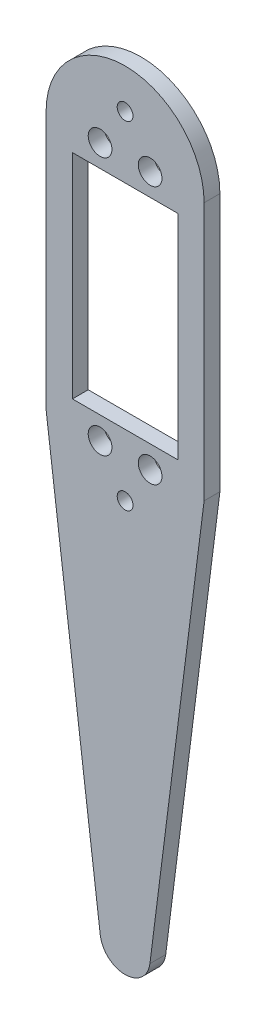
ISO-10303-21;
HEADER;
FILE_DESCRIPTION(('STEP AP214'),'2;1');
FILE_NAME('part.step','',(''),(''),'','','');
FILE_SCHEMA(('AUTOMOTIVE_DESIGN { 1 0 10303 214 1 1 1 1 }'));
ENDSEC;
DATA;
#1=APPLICATION_CONTEXT('core data for automotive mechanical design processes');
#2=APPLICATION_PROTOCOL_DEFINITION('international standard','automotive_design',2000,#1);
#3=PRODUCT_CONTEXT('',#1,'mechanical');
#4=PRODUCT('Part','Part','',(#3));
#5=PRODUCT_RELATED_PRODUCT_CATEGORY('part','',(#4));
#6=PRODUCT_DEFINITION_FORMATION('','',#4);
#7=PRODUCT_DEFINITION_CONTEXT('part definition',#1,'design');
#8=PRODUCT_DEFINITION('design','',#6,#7);
#9=PRODUCT_DEFINITION_SHAPE('','',#8);
#10=(LENGTH_UNIT() NAMED_UNIT(*) SI_UNIT(.MILLI.,.METRE.));
#11=(NAMED_UNIT(*) PLANE_ANGLE_UNIT() SI_UNIT($,.RADIAN.));
#12=(NAMED_UNIT(*) SI_UNIT($,.STERADIAN.) SOLID_ANGLE_UNIT());
#13=UNCERTAINTY_MEASURE_WITH_UNIT(LENGTH_MEASURE(1.E-05),#10,'distance_accuracy_value','');
#14=(GEOMETRIC_REPRESENTATION_CONTEXT(3) GLOBAL_UNCERTAINTY_ASSIGNED_CONTEXT((#13)) GLOBAL_UNIT_ASSIGNED_CONTEXT((#10,
#11,#12)) REPRESENTATION_CONTEXT('',''));
#15=CARTESIAN_POINT('',(0.,0.,0.));
#16=DIRECTION('',(0.,0.,1.));
#17=DIRECTION('',(1.,0.,0.));
#18=AXIS2_PLACEMENT_3D('',#15,#16,#17);
#19=CARTESIAN_POINT('',(9.99999999999545,44.7499999999967,3.));
#20=DIRECTION('',(0.,0.,1.));
#21=DIRECTION('',(1.,0.,0.));
#22=AXIS2_PLACEMENT_3D('',#19,#20,#21);
#23=PLANE('',#22);
#24=CARTESIAN_POINT('',(10.0000000000035,52.2499999999999,3.));
#25=DIRECTION('',(0.,0.,1.));
#26=DIRECTION('',(1.,0.,0.));
#27=AXIS2_PLACEMENT_3D('',#24,#25,#26);
#28=CIRCLE('',#27,1.5);
#29=CARTESIAN_POINT('',(11.5000000000035,52.2499999999999,3.));
#30=VERTEX_POINT('',#29);
#31=EDGE_CURVE('E285',#30,#30,#28,.T.);
#32=ORIENTED_EDGE('',*,*,#31,.F.);
#33=EDGE_LOOP('',(#32));
#34=FACE_BOUND('',#33,.T.);
#35=CARTESIAN_POINT('',(14.7499999999117,44.7499999999967,3.));
#36=DIRECTION('',(0.,0.,1.));
#37=DIRECTION('',(1.,0.,0.));
#38=AXIS2_PLACEMENT_3D('',#35,#36,#37);
#39=CIRCLE('',#38,2.25);
#40=CARTESIAN_POINT('',(16.9999999999117,44.7499999999967,3.));
#41=VERTEX_POINT('',#40);
#42=EDGE_CURVE('E297',#41,#41,#39,.T.);
#43=ORIENTED_EDGE('',*,*,#42,.F.);
#44=EDGE_LOOP('',(#43));
#45=FACE_BOUND('',#44,.T.);
#46=CARTESIAN_POINT('',(14.7499999999117,-4.25000000000659,3.));
#47=DIRECTION('',(0.,0.,1.));
#48=DIRECTION('',(1.,0.,0.));
#49=AXIS2_PLACEMENT_3D('',#46,#47,#48);
#50=CIRCLE('',#49,2.25);
#51=CARTESIAN_POINT('',(16.9999999999117,-4.25000000000659,3.));
#52=VERTEX_POINT('',#51);
#53=EDGE_CURVE('E142',#52,#52,#50,.T.);
#54=ORIENTED_EDGE('',*,*,#53,.F.);
#55=EDGE_LOOP('',(#54));
#56=FACE_BOUND('',#55,.T.);
#57=CARTESIAN_POINT('',(9.99999999999545,44.7499999999967,3.));
#58=DIRECTION('',(0.,0.,1.));
#59=DIRECTION('',(1.,0.,0.));
#60=AXIS2_PLACEMENT_3D('',#57,#58,#59);
#61=CIRCLE('',#60,14.9999999999159);
#62=CARTESIAN_POINT('',(24.999999999834,44.7499999999967,3.));
#63=VERTEX_POINT('',#62);
#64=CARTESIAN_POINT('',(-4.99999999999773,44.7499999999967,3.));
#65=VERTEX_POINT('',#64);
#66=EDGE_CURVE('E152',#63,#65,#61,.T.);
#67=ORIENTED_EDGE('',*,*,#66,.T.);
#68=DIRECTION('',(0.,-1.,0.));
#69=VECTOR('',#68,1.);
#70=CARTESIAN_POINT('',(-4.99999999999773,44.7499999999967,3.));
#71=LINE('',#70,#69);
#72=CARTESIAN_POINT('',(-4.99999999999773,-4.25000000000659,3.));
#73=VERTEX_POINT('',#72);
#74=EDGE_CURVE('E155',#65,#73,#71,.T.);
#75=ORIENTED_EDGE('',*,*,#74,.T.);
#76=DIRECTION('',(0.12563429234926,-0.992076622336148,0.));
#77=VECTOR('',#76,1.);
#78=CARTESIAN_POINT('',(-4.99999999999773,-4.25000000000659,3.));
#79=LINE('',#78,#77);
#80=CARTESIAN_POINT('',(5.28763604390686,-85.4867628886591,3.));
#81=VERTEX_POINT('',#80);
#82=EDGE_CURVE('E158',#73,#81,#79,.T.);
#83=ORIENTED_EDGE('',*,*,#82,.T.);
#84=CARTESIAN_POINT('',(10.0000000000036,-84.89,3.));
#85=DIRECTION('',(0.,0.,1.));
#86=DIRECTION('',(1.,0.,0.));
#87=AXIS2_PLACEMENT_3D('',#84,#85,#86);
#88=CIRCLE('',#87,4.75000000000001);
#89=CARTESIAN_POINT('',(14.7123639561003,-85.4867628886591,3.));
#90=VERTEX_POINT('',#89);
#91=EDGE_CURVE('E160',#81,#90,#88,.T.);
#92=ORIENTED_EDGE('',*,*,#91,.T.);
#93=DIRECTION('',(0.125634292347197,0.992076622336409,0.));
#94=VECTOR('',#93,1.);
#95=CARTESIAN_POINT('',(24.9999999998328,-4.25000000000989,3.));
#96=LINE('',#95,#94);
#97=CARTESIAN_POINT('',(24.9999999998328,-4.25000000000989,3.));
#98=VERTEX_POINT('',#97);
#99=EDGE_CURVE('E162',#90,#98,#96,.T.);
#100=ORIENTED_EDGE('',*,*,#99,.T.);
#101=DIRECTION('',(0.,1.,0.));
#102=VECTOR('',#101,1.);
#103=CARTESIAN_POINT('',(24.999999999834,44.7499999999967,3.));
#104=LINE('',#103,#102);
#105=EDGE_CURVE('E164',#98,#63,#104,.T.);
#106=ORIENTED_EDGE('',*,*,#105,.T.);
#107=EDGE_LOOP('',(#67,#75,#83,#92,#100,#106));
#108=FACE_BOUND('',#107,.T.);
#109=DIRECTION('',(1.,0.,0.));
#110=VECTOR('',#109,1.);
#111=CARTESIAN_POINT('',(0.,0.,3.));
#112=LINE('',#111,#110);
#113=CARTESIAN_POINT('',(0.,0.,3.));
#114=VERTEX_POINT('',#113);
#115=CARTESIAN_POINT('',(20.,0.,3.));
#116=VERTEX_POINT('',#115);
#117=EDGE_CURVE('E121',#114,#116,#112,.T.);
#118=ORIENTED_EDGE('',*,*,#117,.F.);
#119=DIRECTION('',(0.,-1.,0.));
#120=VECTOR('',#119,1.);
#121=CARTESIAN_POINT('',(0.,0.,3.));
#122=LINE('',#121,#120);
#123=CARTESIAN_POINT('',(0.,40.5,3.));
#124=VERTEX_POINT('',#123);
#125=EDGE_CURVE('E113',#124,#114,#122,.T.);
#126=ORIENTED_EDGE('',*,*,#125,.F.);
#127=DIRECTION('',(-1.,0.,0.));
#128=VECTOR('',#127,1.);
#129=CARTESIAN_POINT('',(0.,40.5,3.));
#130=LINE('',#129,#128);
#131=CARTESIAN_POINT('',(20.,40.5,3.));
#132=VERTEX_POINT('',#131);
#133=EDGE_CURVE('E136',#132,#124,#130,.T.);
#134=ORIENTED_EDGE('',*,*,#133,.F.);
#135=DIRECTION('',(0.,1.,0.));
#136=VECTOR('',#135,1.);
#137=CARTESIAN_POINT('',(20.,0.,3.));
#138=LINE('',#137,#136);
#139=EDGE_CURVE('E134',#116,#132,#138,.T.);
#140=ORIENTED_EDGE('',*,*,#139,.F.);
#141=EDGE_LOOP('',(#118,#126,#134,#140));
#142=FACE_BOUND('',#141,.T.);
#143=CARTESIAN_POINT('',(5.24999999991035,-4.25000000000659,3.));
#144=DIRECTION('',(0.,0.,1.));
#145=DIRECTION('',(1.,0.,0.));
#146=AXIS2_PLACEMENT_3D('',#143,#144,#145);
#147=CIRCLE('',#146,2.25);
#148=CARTESIAN_POINT('',(7.49999999991035,-4.25000000000659,3.));
#149=VERTEX_POINT('',#148);
#150=EDGE_CURVE('E303',#149,#149,#147,.T.);
#151=ORIENTED_EDGE('',*,*,#150,.F.);
#152=EDGE_LOOP('',(#151));
#153=FACE_BOUND('',#152,.T.);
#154=CARTESIAN_POINT('',(5.24999999991035,44.7499999999967,3.));
#155=DIRECTION('',(0.,0.,1.));
#156=DIRECTION('',(1.,0.,0.));
#157=AXIS2_PLACEMENT_3D('',#154,#155,#156);
#158=CIRCLE('',#157,2.25);
#159=CARTESIAN_POINT('',(7.49999999991035,44.7499999999967,3.));
#160=VERTEX_POINT('',#159);
#161=EDGE_CURVE('E291',#160,#160,#158,.T.);
#162=ORIENTED_EDGE('',*,*,#161,.F.);
#163=EDGE_LOOP('',(#162));
#164=FACE_BOUND('',#163,.T.);
#165=CARTESIAN_POINT('',(10.0000000000035,-11.75,3.));
#166=DIRECTION('',(0.,0.,1.));
#167=DIRECTION('',(1.,0.,0.));
#168=AXIS2_PLACEMENT_3D('',#165,#166,#167);
#169=CIRCLE('',#168,1.5);
#170=CARTESIAN_POINT('',(11.5000000000035,-11.75,3.));
#171=VERTEX_POINT('',#170);
#172=EDGE_CURVE('E276',#171,#171,#169,.T.);
#173=ORIENTED_EDGE('',*,*,#172,.F.);
#174=EDGE_LOOP('',(#173));
#175=FACE_BOUND('',#174,.T.);
#176=ADVANCED_FACE('F36',(#34,#45,#56,#108,#142,#153,#164,#175),#23,.T.);
#177=CARTESIAN_POINT('',(9.99999999999545,44.7499999999967,0.));
#178=DIRECTION('',(0.,0.,1.));
#179=DIRECTION('',(1.,0.,0.));
#180=AXIS2_PLACEMENT_3D('',#177,#178,#179);
#181=PLANE('',#180);
#182=CARTESIAN_POINT('',(10.0000000000035,52.2499999999999,0.));
#183=DIRECTION('',(0.,0.,1.));
#184=DIRECTION('',(1.,0.,0.));
#185=AXIS2_PLACEMENT_3D('',#182,#183,#184);
#186=CIRCLE('',#185,1.5);
#187=CARTESIAN_POINT('',(11.5000000000035,52.2499999999999,0.));
#188=VERTEX_POINT('',#187);
#189=EDGE_CURVE('E282',#188,#188,#186,.T.);
#190=ORIENTED_EDGE('',*,*,#189,.T.);
#191=EDGE_LOOP('',(#190));
#192=FACE_BOUND('',#191,.T.);
#193=CARTESIAN_POINT('',(14.7499999999117,44.7499999999967,0.));
#194=DIRECTION('',(0.,0.,1.));
#195=DIRECTION('',(1.,0.,0.));
#196=AXIS2_PLACEMENT_3D('',#193,#194,#195);
#197=CIRCLE('',#196,2.25);
#198=CARTESIAN_POINT('',(16.9999999999117,44.7499999999967,0.));
#199=VERTEX_POINT('',#198);
#200=EDGE_CURVE('E294',#199,#199,#197,.T.);
#201=ORIENTED_EDGE('',*,*,#200,.T.);
#202=EDGE_LOOP('',(#201));
#203=FACE_BOUND('',#202,.T.);
#204=CARTESIAN_POINT('',(14.7499999999117,-4.25000000000659,0.));
#205=DIRECTION('',(0.,0.,1.));
#206=DIRECTION('',(1.,0.,0.));
#207=AXIS2_PLACEMENT_3D('',#204,#205,#206);
#208=CIRCLE('',#207,2.25);
#209=CARTESIAN_POINT('',(16.9999999999117,-4.25000000000659,0.));
#210=VERTEX_POINT('',#209);
#211=EDGE_CURVE('E306',#210,#210,#208,.T.);
#212=ORIENTED_EDGE('',*,*,#211,.T.);
#213=EDGE_LOOP('',(#212));
#214=FACE_BOUND('',#213,.T.);
#215=CARTESIAN_POINT('',(9.99999999999545,44.7499999999967,0.));
#216=DIRECTION('',(0.,0.,1.));
#217=DIRECTION('',(1.,0.,0.));
#218=AXIS2_PLACEMENT_3D('',#215,#216,#217);
#219=CIRCLE('',#218,14.9999999999159);
#220=CARTESIAN_POINT('',(24.999999999834,44.7499999999967,0.));
#221=VERTEX_POINT('',#220);
#222=CARTESIAN_POINT('',(-4.99999999999773,44.7499999999967,0.));
#223=VERTEX_POINT('',#222);
#224=EDGE_CURVE('E129',#221,#223,#219,.T.);
#225=ORIENTED_EDGE('',*,*,#224,.F.);
#226=DIRECTION('',(0.,1.,0.));
#227=VECTOR('',#226,1.);
#228=CARTESIAN_POINT('',(24.999999999834,44.7499999999967,0.));
#229=LINE('',#228,#227);
#230=CARTESIAN_POINT('',(24.9999999998328,-4.25000000000989,0.));
#231=VERTEX_POINT('',#230);
#232=EDGE_CURVE('E156',#231,#221,#229,.T.);
#233=ORIENTED_EDGE('',*,*,#232,.F.);
#234=DIRECTION('',(0.125634292347197,0.992076622336409,0.));
#235=VECTOR('',#234,1.);
#236=CARTESIAN_POINT('',(24.9999999998328,-4.25000000000989,0.));
#237=LINE('',#236,#235);
#238=CARTESIAN_POINT('',(14.7123639561003,-85.4867628886591,0.));
#239=VERTEX_POINT('',#238);
#240=EDGE_CURVE('E175',#239,#231,#237,.T.);
#241=ORIENTED_EDGE('',*,*,#240,.F.);
#242=CARTESIAN_POINT('',(10.0000000000036,-84.89,0.));
#243=DIRECTION('',(0.,0.,1.));
#244=DIRECTION('',(1.,0.,0.));
#245=AXIS2_PLACEMENT_3D('',#242,#243,#244);
#246=CIRCLE('',#245,4.75000000000001);
#247=CARTESIAN_POINT('',(5.28763604390686,-85.4867628886591,0.));
#248=VERTEX_POINT('',#247);
#249=EDGE_CURVE('E173',#248,#239,#246,.T.);
#250=ORIENTED_EDGE('',*,*,#249,.F.);
#251=DIRECTION('',(0.12563429234926,-0.992076622336148,0.));
#252=VECTOR('',#251,1.);
#253=CARTESIAN_POINT('',(-4.99999999999773,-4.25000000000659,0.));
#254=LINE('',#253,#252);
#255=CARTESIAN_POINT('',(-4.99999999999773,-4.25000000000659,0.));
#256=VERTEX_POINT('',#255);
#257=EDGE_CURVE('E171',#256,#248,#254,.T.);
#258=ORIENTED_EDGE('',*,*,#257,.F.);
#259=DIRECTION('',(0.,-1.,0.));
#260=VECTOR('',#259,1.);
#261=CARTESIAN_POINT('',(-4.99999999999773,44.7499999999967,0.));
#262=LINE('',#261,#260);
#263=EDGE_CURVE('E169',#223,#256,#262,.T.);
#264=ORIENTED_EDGE('',*,*,#263,.F.);
#265=EDGE_LOOP('',(#225,#233,#241,#250,#258,#264));
#266=FACE_BOUND('',#265,.T.);
#267=DIRECTION('',(0.,-1.,0.));
#268=VECTOR('',#267,1.);
#269=CARTESIAN_POINT('',(0.,0.,0.));
#270=LINE('',#269,#268);
#271=CARTESIAN_POINT('',(0.,40.5,0.));
#272=VERTEX_POINT('',#271);
#273=CARTESIAN_POINT('',(0.,0.,0.));
#274=VERTEX_POINT('',#273);
#275=EDGE_CURVE('E59',#272,#274,#270,.T.);
#276=ORIENTED_EDGE('',*,*,#275,.T.);
#277=DIRECTION('',(1.,0.,0.));
#278=VECTOR('',#277,1.);
#279=CARTESIAN_POINT('',(0.,0.,0.));
#280=LINE('',#279,#278);
#281=CARTESIAN_POINT('',(20.,0.,0.));
#282=VERTEX_POINT('',#281);
#283=EDGE_CURVE('E128',#274,#282,#280,.T.);
#284=ORIENTED_EDGE('',*,*,#283,.T.);
#285=DIRECTION('',(0.,1.,0.));
#286=VECTOR('',#285,1.);
#287=CARTESIAN_POINT('',(20.,0.,0.));
#288=LINE('',#287,#286);
#289=CARTESIAN_POINT('',(20.,40.5,0.));
#290=VERTEX_POINT('',#289);
#291=EDGE_CURVE('E144',#282,#290,#288,.T.);
#292=ORIENTED_EDGE('',*,*,#291,.T.);
#293=DIRECTION('',(-1.,0.,0.));
#294=VECTOR('',#293,1.);
#295=CARTESIAN_POINT('',(0.,40.5,0.));
#296=LINE('',#295,#294);
#297=EDGE_CURVE('E122',#290,#272,#296,.T.);
#298=ORIENTED_EDGE('',*,*,#297,.T.);
#299=EDGE_LOOP('',(#276,#284,#292,#298));
#300=FACE_BOUND('',#299,.T.);
#301=CARTESIAN_POINT('',(5.24999999991035,-4.25000000000659,0.));
#302=DIRECTION('',(0.,0.,1.));
#303=DIRECTION('',(1.,0.,0.));
#304=AXIS2_PLACEMENT_3D('',#301,#302,#303);
#305=CIRCLE('',#304,2.25);
#306=CARTESIAN_POINT('',(7.49999999991035,-4.25000000000659,0.));
#307=VERTEX_POINT('',#306);
#308=EDGE_CURVE('E300',#307,#307,#305,.T.);
#309=ORIENTED_EDGE('',*,*,#308,.T.);
#310=EDGE_LOOP('',(#309));
#311=FACE_BOUND('',#310,.T.);
#312=CARTESIAN_POINT('',(5.24999999991035,44.7499999999967,0.));
#313=DIRECTION('',(0.,0.,1.));
#314=DIRECTION('',(1.,0.,0.));
#315=AXIS2_PLACEMENT_3D('',#312,#313,#314);
#316=CIRCLE('',#315,2.25);
#317=CARTESIAN_POINT('',(7.49999999991035,44.7499999999967,0.));
#318=VERTEX_POINT('',#317);
#319=EDGE_CURVE('E288',#318,#318,#316,.T.);
#320=ORIENTED_EDGE('',*,*,#319,.T.);
#321=EDGE_LOOP('',(#320));
#322=FACE_BOUND('',#321,.T.);
#323=CARTESIAN_POINT('',(10.0000000000035,-11.75,0.));
#324=DIRECTION('',(0.,0.,1.));
#325=DIRECTION('',(1.,0.,0.));
#326=AXIS2_PLACEMENT_3D('',#323,#324,#325);
#327=CIRCLE('',#326,1.5);
#328=CARTESIAN_POINT('',(11.5000000000035,-11.75,0.));
#329=VERTEX_POINT('',#328);
#330=EDGE_CURVE('E279',#329,#329,#327,.T.);
#331=ORIENTED_EDGE('',*,*,#330,.T.);
#332=EDGE_LOOP('',(#331));
#333=FACE_BOUND('',#332,.T.);
#334=ADVANCED_FACE('F199',(#192,#203,#214,#266,#300,#311,#322,#333),#181,.F.);
#335=CARTESIAN_POINT('',(9.99999999999545,44.7499999999967,3.));
#336=DIRECTION('',(0.,0.,-1.));
#337=DIRECTION('',(-1.,0.,0.));
#338=AXIS2_PLACEMENT_3D('',#335,#336,#337);
#339=CYLINDRICAL_SURFACE('',#338,14.9999999999159);
#340=ORIENTED_EDGE('',*,*,#224,.T.);
#341=DIRECTION('',(0.,0.,-1.));
#342=VECTOR('',#341,1.);
#343=CARTESIAN_POINT('',(-4.99999999999773,44.7499999999967,3.));
#344=LINE('',#343,#342);
#345=EDGE_CURVE('E11',#65,#223,#344,.T.);
#346=ORIENTED_EDGE('',*,*,#345,.F.);
#347=ORIENTED_EDGE('',*,*,#66,.F.);
#348=DIRECTION('',(0.,0.,-1.));
#349=VECTOR('',#348,1.);
#350=CARTESIAN_POINT('',(24.999999999834,44.7499999999967,3.));
#351=LINE('',#350,#349);
#352=EDGE_CURVE('E166',#63,#221,#351,.T.);
#353=ORIENTED_EDGE('',*,*,#352,.T.);
#354=EDGE_LOOP('',(#340,#346,#347,#353));
#355=FACE_BOUND('',#354,.T.);
#356=ADVANCED_FACE('F38',(#355),#339,.T.);
#357=CARTESIAN_POINT('',(-4.99999999999773,44.7499999999967,3.));
#358=DIRECTION('',(1.,0.,0.));
#359=DIRECTION('',(0.,0.,-1.));
#360=AXIS2_PLACEMENT_3D('',#357,#358,#359);
#361=PLANE('',#360);
#362=ORIENTED_EDGE('',*,*,#263,.T.);
#363=DIRECTION('',(0.,0.,-1.));
#364=VECTOR('',#363,1.);
#365=CARTESIAN_POINT('',(-4.99999999999773,-4.25000000000659,3.));
#366=LINE('',#365,#364);
#367=EDGE_CURVE('E44',#73,#256,#366,.T.);
#368=ORIENTED_EDGE('',*,*,#367,.F.);
#369=ORIENTED_EDGE('',*,*,#74,.F.);
#370=ORIENTED_EDGE('',*,*,#345,.T.);
#371=EDGE_LOOP('',(#362,#368,#369,#370));
#372=FACE_BOUND('',#371,.T.);
#373=ADVANCED_FACE('F216',(#372),#361,.F.);
#374=CARTESIAN_POINT('',(-4.99999999999773,-4.25000000000659,3.));
#375=DIRECTION('',(0.992076622336148,0.12563429234926,0.));
#376=DIRECTION('',(-0.12563429234926,0.992076622336148,0.));
#377=AXIS2_PLACEMENT_3D('',#374,#375,#376);
#378=PLANE('',#377);
#379=ORIENTED_EDGE('',*,*,#257,.T.);
#380=DIRECTION('',(0.,0.,-1.));
#381=VECTOR('',#380,1.);
#382=CARTESIAN_POINT('',(5.28763604390686,-85.4867628886591,3.));
#383=LINE('',#382,#381);
#384=EDGE_CURVE('E186',#81,#248,#383,.T.);
#385=ORIENTED_EDGE('',*,*,#384,.F.);
#386=ORIENTED_EDGE('',*,*,#82,.F.);
#387=ORIENTED_EDGE('',*,*,#367,.T.);
#388=EDGE_LOOP('',(#379,#385,#386,#387));
#389=FACE_BOUND('',#388,.T.);
#390=ADVANCED_FACE('F193',(#389),#378,.F.);
#391=CARTESIAN_POINT('',(10.0000000000036,-84.89,3.));
#392=DIRECTION('',(0.,0.,-1.));
#393=DIRECTION('',(-1.,0.,0.));
#394=AXIS2_PLACEMENT_3D('',#391,#392,#393);
#395=CYLINDRICAL_SURFACE('',#394,4.75000000000001);
#396=ORIENTED_EDGE('',*,*,#249,.T.);
#397=DIRECTION('',(0.,0.,-1.));
#398=VECTOR('',#397,1.);
#399=CARTESIAN_POINT('',(14.7123639561003,-85.4867628886591,3.));
#400=LINE('',#399,#398);
#401=EDGE_CURVE('E183',#90,#239,#400,.T.);
#402=ORIENTED_EDGE('',*,*,#401,.F.);
#403=ORIENTED_EDGE('',*,*,#91,.F.);
#404=ORIENTED_EDGE('',*,*,#384,.T.);
#405=EDGE_LOOP('',(#396,#402,#403,#404));
#406=FACE_BOUND('',#405,.T.);
#407=ADVANCED_FACE('F205',(#406),#395,.T.);
#408=CARTESIAN_POINT('',(24.9999999998328,-4.25000000000989,3.));
#409=DIRECTION('',(-0.992076622336409,0.125634292347197,0.));
#410=DIRECTION('',(-0.125634292347197,-0.99207662233641,0.));
#411=AXIS2_PLACEMENT_3D('',#408,#409,#410);
#412=PLANE('',#411);
#413=ORIENTED_EDGE('',*,*,#240,.T.);
#414=DIRECTION('',(0.,0.,-1.));
#415=VECTOR('',#414,1.);
#416=CARTESIAN_POINT('',(24.9999999998328,-4.25000000000989,3.));
#417=LINE('',#416,#415);
#418=EDGE_CURVE('E180',#98,#231,#417,.T.);
#419=ORIENTED_EDGE('',*,*,#418,.F.);
#420=ORIENTED_EDGE('',*,*,#99,.F.);
#421=ORIENTED_EDGE('',*,*,#401,.T.);
#422=EDGE_LOOP('',(#413,#419,#420,#421));
#423=FACE_BOUND('',#422,.T.);
#424=ADVANCED_FACE('F209',(#423),#412,.F.);
#425=CARTESIAN_POINT('',(24.999999999834,44.7499999999967,3.));
#426=DIRECTION('',(-1.,0.,0.));
#427=DIRECTION('',(0.,-1.,0.));
#428=AXIS2_PLACEMENT_3D('',#425,#426,#427);
#429=PLANE('',#428);
#430=ORIENTED_EDGE('',*,*,#232,.T.);
#431=ORIENTED_EDGE('',*,*,#352,.F.);
#432=ORIENTED_EDGE('',*,*,#105,.F.);
#433=ORIENTED_EDGE('',*,*,#418,.T.);
#434=EDGE_LOOP('',(#430,#431,#432,#433));
#435=FACE_BOUND('',#434,.T.);
#436=ADVANCED_FACE('F219',(#435),#429,.F.);
#437=CARTESIAN_POINT('',(0.,0.,3.));
#438=DIRECTION('',(1.,0.,0.));
#439=DIRECTION('',(0.,0.,-1.));
#440=AXIS2_PLACEMENT_3D('',#437,#438,#439);
#441=PLANE('',#440);
#442=ORIENTED_EDGE('',*,*,#275,.F.);
#443=DIRECTION('',(0.,0.,-1.));
#444=VECTOR('',#443,1.);
#445=CARTESIAN_POINT('',(0.,40.5,3.));
#446=LINE('',#445,#444);
#447=EDGE_CURVE('E117',#124,#272,#446,.T.);
#448=ORIENTED_EDGE('',*,*,#447,.F.);
#449=ORIENTED_EDGE('',*,*,#125,.T.);
#450=DIRECTION('',(0.,0.,-1.));
#451=VECTOR('',#450,1.);
#452=CARTESIAN_POINT('',(0.,0.,3.));
#453=LINE('',#452,#451);
#454=EDGE_CURVE('E116',#114,#274,#453,.T.);
#455=ORIENTED_EDGE('',*,*,#454,.T.);
#456=EDGE_LOOP('',(#442,#448,#449,#455));
#457=FACE_BOUND('',#456,.T.);
#458=ADVANCED_FACE('F115',(#457),#441,.T.);
#459=CARTESIAN_POINT('',(0.,0.,3.));
#460=DIRECTION('',(0.,1.,0.));
#461=DIRECTION('',(0.,0.,1.));
#462=AXIS2_PLACEMENT_3D('',#459,#460,#461);
#463=PLANE('',#462);
#464=ORIENTED_EDGE('',*,*,#283,.F.);
#465=ORIENTED_EDGE('',*,*,#454,.F.);
#466=ORIENTED_EDGE('',*,*,#117,.T.);
#467=DIRECTION('',(0.,0.,-1.));
#468=VECTOR('',#467,1.);
#469=CARTESIAN_POINT('',(20.,0.,3.));
#470=LINE('',#469,#468);
#471=EDGE_CURVE('E130',#116,#282,#470,.T.);
#472=ORIENTED_EDGE('',*,*,#471,.T.);
#473=EDGE_LOOP('',(#464,#465,#466,#472));
#474=FACE_BOUND('',#473,.T.);
#475=ADVANCED_FACE('F125',(#474),#463,.T.);
#476=CARTESIAN_POINT('',(20.,0.,3.));
#477=DIRECTION('',(-1.,0.,0.));
#478=DIRECTION('',(0.,0.,1.));
#479=AXIS2_PLACEMENT_3D('',#476,#477,#478);
#480=PLANE('',#479);
#481=ORIENTED_EDGE('',*,*,#291,.F.);
#482=ORIENTED_EDGE('',*,*,#471,.F.);
#483=ORIENTED_EDGE('',*,*,#139,.T.);
#484=DIRECTION('',(0.,0.,-1.));
#485=VECTOR('',#484,1.);
#486=CARTESIAN_POINT('',(20.,40.5,3.));
#487=LINE('',#486,#485);
#488=EDGE_CURVE('E51',#132,#290,#487,.T.);
#489=ORIENTED_EDGE('',*,*,#488,.T.);
#490=EDGE_LOOP('',(#481,#482,#483,#489));
#491=FACE_BOUND('',#490,.T.);
#492=ADVANCED_FACE('F241',(#491),#480,.T.);
#493=CARTESIAN_POINT('',(0.,40.5,3.));
#494=DIRECTION('',(0.,-1.,0.));
#495=DIRECTION('',(0.,0.,-1.));
#496=AXIS2_PLACEMENT_3D('',#493,#494,#495);
#497=PLANE('',#496);
#498=ORIENTED_EDGE('',*,*,#297,.F.);
#499=ORIENTED_EDGE('',*,*,#488,.F.);
#500=ORIENTED_EDGE('',*,*,#133,.T.);
#501=ORIENTED_EDGE('',*,*,#447,.T.);
#502=EDGE_LOOP('',(#498,#499,#500,#501));
#503=FACE_BOUND('',#502,.T.);
#504=ADVANCED_FACE('F244',(#503),#497,.T.);
#505=CARTESIAN_POINT('',(14.7499999999117,-4.25000000000659,3.));
#506=DIRECTION('',(0.,0.,-1.));
#507=DIRECTION('',(-1.,0.,0.));
#508=AXIS2_PLACEMENT_3D('',#505,#506,#507);
#509=CYLINDRICAL_SURFACE('',#508,2.25);
#510=ORIENTED_EDGE('',*,*,#53,.T.);
#511=EDGE_LOOP('',(#510));
#512=FACE_BOUND('',#511,.T.);
#513=ORIENTED_EDGE('',*,*,#211,.F.);
#514=EDGE_LOOP('',(#513));
#515=FACE_BOUND('',#514,.T.);
#516=ADVANCED_FACE('F248',(#512,#515),#509,.F.);
#517=CARTESIAN_POINT('',(5.24999999991035,-4.25000000000659,3.));
#518=DIRECTION('',(0.,0.,-1.));
#519=DIRECTION('',(-1.,0.,0.));
#520=AXIS2_PLACEMENT_3D('',#517,#518,#519);
#521=CYLINDRICAL_SURFACE('',#520,2.25);
#522=ORIENTED_EDGE('',*,*,#150,.T.);
#523=EDGE_LOOP('',(#522));
#524=FACE_BOUND('',#523,.T.);
#525=ORIENTED_EDGE('',*,*,#308,.F.);
#526=EDGE_LOOP('',(#525));
#527=FACE_BOUND('',#526,.T.);
#528=ADVANCED_FACE('F251',(#524,#527),#521,.F.);
#529=CARTESIAN_POINT('',(14.7499999999117,44.7499999999967,3.));
#530=DIRECTION('',(0.,0.,-1.));
#531=DIRECTION('',(-1.,0.,0.));
#532=AXIS2_PLACEMENT_3D('',#529,#530,#531);
#533=CYLINDRICAL_SURFACE('',#532,2.25);
#534=ORIENTED_EDGE('',*,*,#42,.T.);
#535=EDGE_LOOP('',(#534));
#536=FACE_BOUND('',#535,.T.);
#537=ORIENTED_EDGE('',*,*,#200,.F.);
#538=EDGE_LOOP('',(#537));
#539=FACE_BOUND('',#538,.T.);
#540=ADVANCED_FACE('F255',(#536,#539),#533,.F.);
#541=CARTESIAN_POINT('',(5.24999999991035,44.7499999999967,3.));
#542=DIRECTION('',(0.,0.,-1.));
#543=DIRECTION('',(-1.,0.,0.));
#544=AXIS2_PLACEMENT_3D('',#541,#542,#543);
#545=CYLINDRICAL_SURFACE('',#544,2.25);
#546=ORIENTED_EDGE('',*,*,#161,.T.);
#547=EDGE_LOOP('',(#546));
#548=FACE_BOUND('',#547,.T.);
#549=ORIENTED_EDGE('',*,*,#319,.F.);
#550=EDGE_LOOP('',(#549));
#551=FACE_BOUND('',#550,.T.);
#552=ADVANCED_FACE('F259',(#548,#551),#545,.F.);
#553=CARTESIAN_POINT('',(10.0000000000035,52.2499999999999,3.));
#554=DIRECTION('',(0.,0.,-1.));
#555=DIRECTION('',(-1.,0.,0.));
#556=AXIS2_PLACEMENT_3D('',#553,#554,#555);
#557=CYLINDRICAL_SURFACE('',#556,1.5);
#558=ORIENTED_EDGE('',*,*,#31,.T.);
#559=EDGE_LOOP('',(#558));
#560=FACE_BOUND('',#559,.T.);
#561=ORIENTED_EDGE('',*,*,#189,.F.);
#562=EDGE_LOOP('',(#561));
#563=FACE_BOUND('',#562,.T.);
#564=ADVANCED_FACE('F263',(#560,#563),#557,.F.);
#565=CARTESIAN_POINT('',(10.0000000000035,-11.75,3.));
#566=DIRECTION('',(0.,0.,-1.));
#567=DIRECTION('',(-1.,0.,0.));
#568=AXIS2_PLACEMENT_3D('',#565,#566,#567);
#569=CYLINDRICAL_SURFACE('',#568,1.5);
#570=ORIENTED_EDGE('',*,*,#172,.T.);
#571=EDGE_LOOP('',(#570));
#572=FACE_BOUND('',#571,.T.);
#573=ORIENTED_EDGE('',*,*,#330,.F.);
#574=EDGE_LOOP('',(#573));
#575=FACE_BOUND('',#574,.T.);
#576=ADVANCED_FACE('F267',(#572,#575),#569,.F.);
#577=CLOSED_SHELL('',(#176,#334,#356,#373,#390,#407,#424,#436,#458,#475,#492,#504,#516,#528,
#540,#552,#564,#576));
#578=MANIFOLD_SOLID_BREP('B2',#577);
#579=ADVANCED_BREP_SHAPE_REPRESENTATION('',(#18,#578),#14);
#580=SHAPE_DEFINITION_REPRESENTATION(#9,#579);
ENDSEC;
END-ISO-10303-21;
